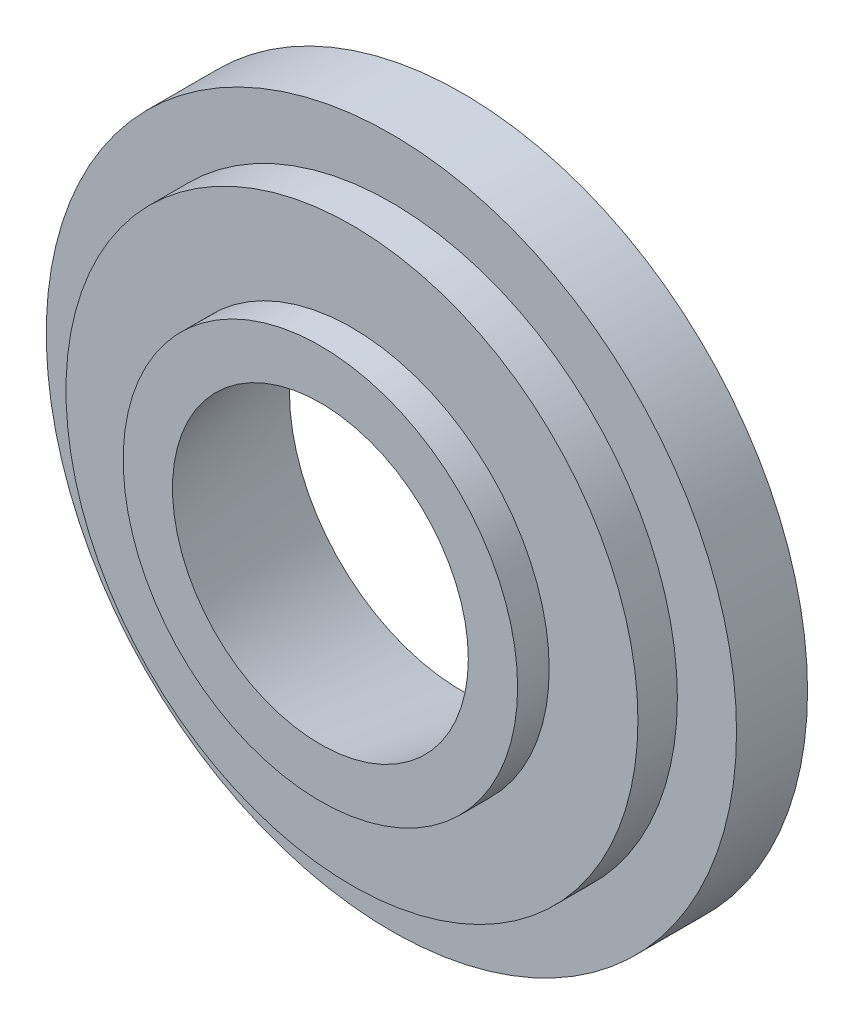
ISO-10303-21;
HEADER;
FILE_DESCRIPTION(('STEP AP214'),'2;1');
FILE_NAME('part.step','',(''),(''),'','','');
FILE_SCHEMA(('AUTOMOTIVE_DESIGN { 1 0 10303 214 1 1 1 1 }'));
ENDSEC;
DATA;
#1=APPLICATION_CONTEXT('core data for automotive mechanical design processes');
#2=APPLICATION_PROTOCOL_DEFINITION('international standard','automotive_design',2000,#1);
#3=PRODUCT_CONTEXT('',#1,'mechanical');
#4=PRODUCT('Part','Part','',(#3));
#5=PRODUCT_RELATED_PRODUCT_CATEGORY('part','',(#4));
#6=PRODUCT_DEFINITION_FORMATION('','',#4);
#7=PRODUCT_DEFINITION_CONTEXT('part definition',#1,'design');
#8=PRODUCT_DEFINITION('design','',#6,#7);
#9=PRODUCT_DEFINITION_SHAPE('','',#8);
#10=(LENGTH_UNIT() NAMED_UNIT(*) SI_UNIT(.MILLI.,.METRE.));
#11=(NAMED_UNIT(*) PLANE_ANGLE_UNIT() SI_UNIT($,.RADIAN.));
#12=(NAMED_UNIT(*) SI_UNIT($,.STERADIAN.) SOLID_ANGLE_UNIT());
#13=UNCERTAINTY_MEASURE_WITH_UNIT(LENGTH_MEASURE(1.E-05),#10,'distance_accuracy_value','');
#14=(GEOMETRIC_REPRESENTATION_CONTEXT(3) GLOBAL_UNCERTAINTY_ASSIGNED_CONTEXT((#13)) GLOBAL_UNIT_ASSIGNED_CONTEXT((#10,
#11,#12)) REPRESENTATION_CONTEXT('',''));
#15=CARTESIAN_POINT('',(0.,0.,0.));
#16=DIRECTION('',(0.,0.,1.));
#17=DIRECTION('',(1.,0.,0.));
#18=AXIS2_PLACEMENT_3D('',#15,#16,#17);
#19=CARTESIAN_POINT('',(0.,0.,18.));
#20=DIRECTION('',(0.,0.,-1.));
#21=DIRECTION('',(-1.,0.,0.));
#22=AXIS2_PLACEMENT_3D('',#19,#20,#21);
#23=CYLINDRICAL_SURFACE('',#22,87.5);
#24=CARTESIAN_POINT('',(0.,0.,18.));
#25=DIRECTION('',(0.,0.,1.));
#26=DIRECTION('',(1.,0.,0.));
#27=AXIS2_PLACEMENT_3D('',#24,#25,#26);
#28=CIRCLE('',#27,87.5);
#29=CARTESIAN_POINT('',(87.5,0.,18.));
#30=VERTEX_POINT('',#29);
#31=EDGE_CURVE('E49',#30,#30,#28,.T.);
#32=ORIENTED_EDGE('',*,*,#31,.F.);
#33=EDGE_LOOP('',(#32));
#34=FACE_BOUND('',#33,.T.);
#35=CARTESIAN_POINT('',(0.,0.,0.));
#36=DIRECTION('',(0.,0.,1.));
#37=DIRECTION('',(1.,0.,0.));
#38=AXIS2_PLACEMENT_3D('',#35,#36,#37);
#39=CIRCLE('',#38,87.5);
#40=CARTESIAN_POINT('',(87.5,0.,0.));
#41=VERTEX_POINT('',#40);
#42=EDGE_CURVE('E40',#41,#41,#39,.T.);
#43=ORIENTED_EDGE('',*,*,#42,.T.);
#44=EDGE_LOOP('',(#43));
#45=FACE_BOUND('',#44,.T.);
#46=ADVANCED_FACE('F37',(#34,#45),#23,.T.);
#47=CARTESIAN_POINT('',(0.,0.,18.));
#48=DIRECTION('',(0.,0.,1.));
#49=DIRECTION('',(1.,0.,0.));
#50=AXIS2_PLACEMENT_3D('',#47,#48,#49);
#51=PLANE('',#50);
#52=CARTESIAN_POINT('',(0.,0.,18.));
#53=DIRECTION('',(0.,0.,1.));
#54=DIRECTION('',(1.,0.,0.));
#55=AXIS2_PLACEMENT_3D('',#52,#53,#54);
#56=CIRCLE('',#55,72.5);
#57=CARTESIAN_POINT('',(72.5,0.,18.));
#58=VERTEX_POINT('',#57);
#59=EDGE_CURVE('E44',#58,#58,#56,.T.);
#60=ORIENTED_EDGE('',*,*,#59,.F.);
#61=EDGE_LOOP('',(#60));
#62=FACE_BOUND('',#61,.T.);
#63=ORIENTED_EDGE('',*,*,#31,.T.);
#64=EDGE_LOOP('',(#63));
#65=FACE_BOUND('',#64,.T.);
#66=ADVANCED_FACE('F67',(#62,#65),#51,.T.);
#67=CARTESIAN_POINT('',(0.,0.,0.));
#68=DIRECTION('',(0.,0.,1.));
#69=DIRECTION('',(1.,0.,0.));
#70=AXIS2_PLACEMENT_3D('',#67,#68,#69);
#71=PLANE('',#70);
#72=CARTESIAN_POINT('',(0.,0.,0.));
#73=DIRECTION('',(0.,0.,-1.));
#74=DIRECTION('',(-1.,0.,0.));
#75=AXIS2_PLACEMENT_3D('',#72,#73,#74);
#76=CIRCLE('',#75,60.5);
#77=CARTESIAN_POINT('',(-60.5,0.,0.));
#78=VERTEX_POINT('',#77);
#79=EDGE_CURVE('E187',#78,#78,#76,.T.);
#80=ORIENTED_EDGE('',*,*,#79,.F.);
#81=EDGE_LOOP('',(#80));
#82=FACE_BOUND('',#81,.T.);
#83=ORIENTED_EDGE('',*,*,#42,.F.);
#84=EDGE_LOOP('',(#83));
#85=FACE_BOUND('',#84,.T.);
#86=ADVANCED_FACE('F64',(#82,#85),#71,.F.);
#87=CARTESIAN_POINT('',(0.,0.,28.));
#88=DIRECTION('',(0.,0.,-1.));
#89=DIRECTION('',(-1.,0.,0.));
#90=AXIS2_PLACEMENT_3D('',#87,#88,#89);
#91=CYLINDRICAL_SURFACE('',#90,72.5);
#92=CARTESIAN_POINT('',(0.,0.,28.));
#93=DIRECTION('',(0.,0.,1.));
#94=DIRECTION('',(1.,0.,0.));
#95=AXIS2_PLACEMENT_3D('',#92,#93,#94);
#96=CIRCLE('',#95,72.5);
#97=CARTESIAN_POINT('',(72.5,0.,28.));
#98=VERTEX_POINT('',#97);
#99=EDGE_CURVE('E55',#98,#98,#96,.T.);
#100=ORIENTED_EDGE('',*,*,#99,.F.);
#101=EDGE_LOOP('',(#100));
#102=FACE_BOUND('',#101,.T.);
#103=ORIENTED_EDGE('',*,*,#59,.T.);
#104=EDGE_LOOP('',(#103));
#105=FACE_BOUND('',#104,.T.);
#106=ADVANCED_FACE('F66',(#102,#105),#91,.T.);
#107=CARTESIAN_POINT('',(0.,0.,28.));
#108=DIRECTION('',(0.,0.,1.));
#109=DIRECTION('',(1.,0.,0.));
#110=AXIS2_PLACEMENT_3D('',#107,#108,#109);
#111=PLANE('',#110);
#112=CARTESIAN_POINT('',(0.,0.,28.));
#113=DIRECTION('',(0.,0.,1.));
#114=DIRECTION('',(1.,0.,0.));
#115=AXIS2_PLACEMENT_3D('',#112,#113,#114);
#116=CIRCLE('',#115,50.);
#117=CARTESIAN_POINT('',(50.,0.,28.));
#118=VERTEX_POINT('',#117);
#119=EDGE_CURVE('E10',#118,#118,#116,.T.);
#120=ORIENTED_EDGE('',*,*,#119,.F.);
#121=EDGE_LOOP('',(#120));
#122=FACE_BOUND('',#121,.T.);
#123=ORIENTED_EDGE('',*,*,#99,.T.);
#124=EDGE_LOOP('',(#123));
#125=FACE_BOUND('',#124,.T.);
#126=ADVANCED_FACE('F75',(#122,#125),#111,.T.);
#127=CARTESIAN_POINT('',(0.,0.,36.));
#128=DIRECTION('',(0.,0.,-1.));
#129=DIRECTION('',(-1.,0.,0.));
#130=AXIS2_PLACEMENT_3D('',#127,#128,#129);
#131=CYLINDRICAL_SURFACE('',#130,50.);
#132=CARTESIAN_POINT('',(0.,0.,36.));
#133=DIRECTION('',(0.,0.,1.));
#134=DIRECTION('',(1.,0.,0.));
#135=AXIS2_PLACEMENT_3D('',#132,#133,#134);
#136=CIRCLE('',#135,50.);
#137=CARTESIAN_POINT('',(50.,0.,36.));
#138=VERTEX_POINT('',#137);
#139=EDGE_CURVE('E53',#138,#138,#136,.T.);
#140=ORIENTED_EDGE('',*,*,#139,.F.);
#141=EDGE_LOOP('',(#140));
#142=FACE_BOUND('',#141,.T.);
#143=ORIENTED_EDGE('',*,*,#119,.T.);
#144=EDGE_LOOP('',(#143));
#145=FACE_BOUND('',#144,.T.);
#146=ADVANCED_FACE('F106',(#142,#145),#131,.T.);
#147=CARTESIAN_POINT('',(0.,0.,36.));
#148=DIRECTION('',(0.,0.,1.));
#149=DIRECTION('',(1.,0.,0.));
#150=AXIS2_PLACEMENT_3D('',#147,#148,#149);
#151=PLANE('',#150);
#152=CARTESIAN_POINT('',(0.,0.,36.));
#153=DIRECTION('',(0.,0.,1.));
#154=DIRECTION('',(1.,0.,0.));
#155=AXIS2_PLACEMENT_3D('',#152,#153,#154);
#156=CIRCLE('',#155,37.5);
#157=CARTESIAN_POINT('',(37.5,0.,36.));
#158=VERTEX_POINT('',#157);
#159=EDGE_CURVE('E179',#158,#158,#156,.T.);
#160=ORIENTED_EDGE('',*,*,#159,.F.);
#161=EDGE_LOOP('',(#160));
#162=FACE_BOUND('',#161,.T.);
#163=ORIENTED_EDGE('',*,*,#139,.T.);
#164=EDGE_LOOP('',(#163));
#165=FACE_BOUND('',#164,.T.);
#166=ADVANCED_FACE('F114',(#162,#165),#151,.T.);
#167=CARTESIAN_POINT('',(0.,0.,5.));
#168=DIRECTION('',(0.,0.,-1.));
#169=DIRECTION('',(-1.,0.,0.));
#170=AXIS2_PLACEMENT_3D('',#167,#168,#169);
#171=CYLINDRICAL_SURFACE('',#170,60.5);
#172=CARTESIAN_POINT('',(0.,0.,5.));
#173=DIRECTION('',(0.,0.,-1.));
#174=DIRECTION('',(-1.,0.,0.));
#175=AXIS2_PLACEMENT_3D('',#172,#173,#174);
#176=CIRCLE('',#175,60.5);
#177=CARTESIAN_POINT('',(-60.5,0.,5.));
#178=VERTEX_POINT('',#177);
#179=EDGE_CURVE('E190',#178,#178,#176,.T.);
#180=ORIENTED_EDGE('',*,*,#179,.F.);
#181=EDGE_LOOP('',(#180));
#182=FACE_BOUND('',#181,.T.);
#183=ORIENTED_EDGE('',*,*,#79,.T.);
#184=EDGE_LOOP('',(#183));
#185=FACE_BOUND('',#184,.T.);
#186=ADVANCED_FACE('F127',(#182,#185),#171,.F.);
#187=CARTESIAN_POINT('',(0.,0.,5.));
#188=DIRECTION('',(0.,0.,-1.));
#189=DIRECTION('',(-1.,0.,0.));
#190=AXIS2_PLACEMENT_3D('',#187,#188,#189);
#191=PLANE('',#190);
#192=CARTESIAN_POINT('',(0.,0.,5.));
#193=DIRECTION('',(0.,0.,-1.));
#194=DIRECTION('',(-1.,0.,0.));
#195=AXIS2_PLACEMENT_3D('',#192,#193,#194);
#196=CIRCLE('',#195,51.5);
#197=CARTESIAN_POINT('',(-51.5,0.,5.));
#198=VERTEX_POINT('',#197);
#199=EDGE_CURVE('E184',#198,#198,#196,.T.);
#200=ORIENTED_EDGE('',*,*,#199,.F.);
#201=EDGE_LOOP('',(#200));
#202=FACE_BOUND('',#201,.T.);
#203=ORIENTED_EDGE('',*,*,#179,.T.);
#204=EDGE_LOOP('',(#203));
#205=FACE_BOUND('',#204,.T.);
#206=ADVANCED_FACE('F142',(#202,#205),#191,.T.);
#207=CARTESIAN_POINT('',(0.,0.,5.));
#208=DIRECTION('',(0.,0.,-1.));
#209=DIRECTION('',(-1.,0.,0.));
#210=AXIS2_PLACEMENT_3D('',#207,#208,#209);
#211=CYLINDRICAL_SURFACE('',#210,51.5);
#212=ORIENTED_EDGE('',*,*,#199,.T.);
#213=EDGE_LOOP('',(#212));
#214=FACE_BOUND('',#213,.T.);
#215=CARTESIAN_POINT('',(0.,0.,0.));
#216=DIRECTION('',(0.,0.,-1.));
#217=DIRECTION('',(-1.,0.,0.));
#218=AXIS2_PLACEMENT_3D('',#215,#216,#217);
#219=CIRCLE('',#218,51.5);
#220=CARTESIAN_POINT('',(-51.5,0.,0.));
#221=VERTEX_POINT('',#220);
#222=EDGE_CURVE('E181',#221,#221,#219,.T.);
#223=ORIENTED_EDGE('',*,*,#222,.F.);
#224=EDGE_LOOP('',(#223));
#225=FACE_BOUND('',#224,.T.);
#226=ADVANCED_FACE('F84',(#214,#225),#211,.T.);
#227=CARTESIAN_POINT('',(0.,0.,0.));
#228=DIRECTION('',(0.,0.,1.));
#229=DIRECTION('',(1.,0.,0.));
#230=AXIS2_PLACEMENT_3D('',#227,#228,#229);
#231=CIRCLE('',#230,43.8477713055048);
#232=CARTESIAN_POINT('',(43.8477713055048,0.,0.));
#233=VERTEX_POINT('',#232);
#234=EDGE_CURVE('E176',#233,#233,#231,.T.);
#235=ORIENTED_EDGE('',*,*,#234,.T.);
#236=EDGE_LOOP('',(#235));
#237=FACE_BOUND('',#236,.T.);
#238=ORIENTED_EDGE('',*,*,#222,.T.);
#239=EDGE_LOOP('',(#238));
#240=FACE_BOUND('',#239,.T.);
#241=ADVANCED_FACE('F69',(#237,#240),#71,.F.);
#242=CARTESIAN_POINT('',(0.,0.,36.));
#243=DIRECTION('',(0.,0.,-1.));
#244=DIRECTION('',(1.,0.,0.));
#245=AXIS2_PLACEMENT_3D('',#242,#243,#244);
#246=CONICAL_SURFACE('',#245,37.5,0.174532925199433);
#247=ORIENTED_EDGE('',*,*,#234,.F.);
#248=EDGE_LOOP('',(#247));
#249=FACE_BOUND('',#248,.T.);
#250=ORIENTED_EDGE('',*,*,#159,.T.);
#251=EDGE_LOOP('',(#250));
#252=FACE_BOUND('',#251,.T.);
#253=ADVANCED_FACE('F83',(#249,#252),#246,.F.);
#254=CLOSED_SHELL('',(#46,#66,#86,#106,#126,#146,#166,#186,#206,#226,#241,#253));
#255=MANIFOLD_SOLID_BREP('B2',#254);
#256=ADVANCED_BREP_SHAPE_REPRESENTATION('',(#18,#255),#14);
#257=SHAPE_DEFINITION_REPRESENTATION(#9,#256);
ENDSEC;
END-ISO-10303-21;
